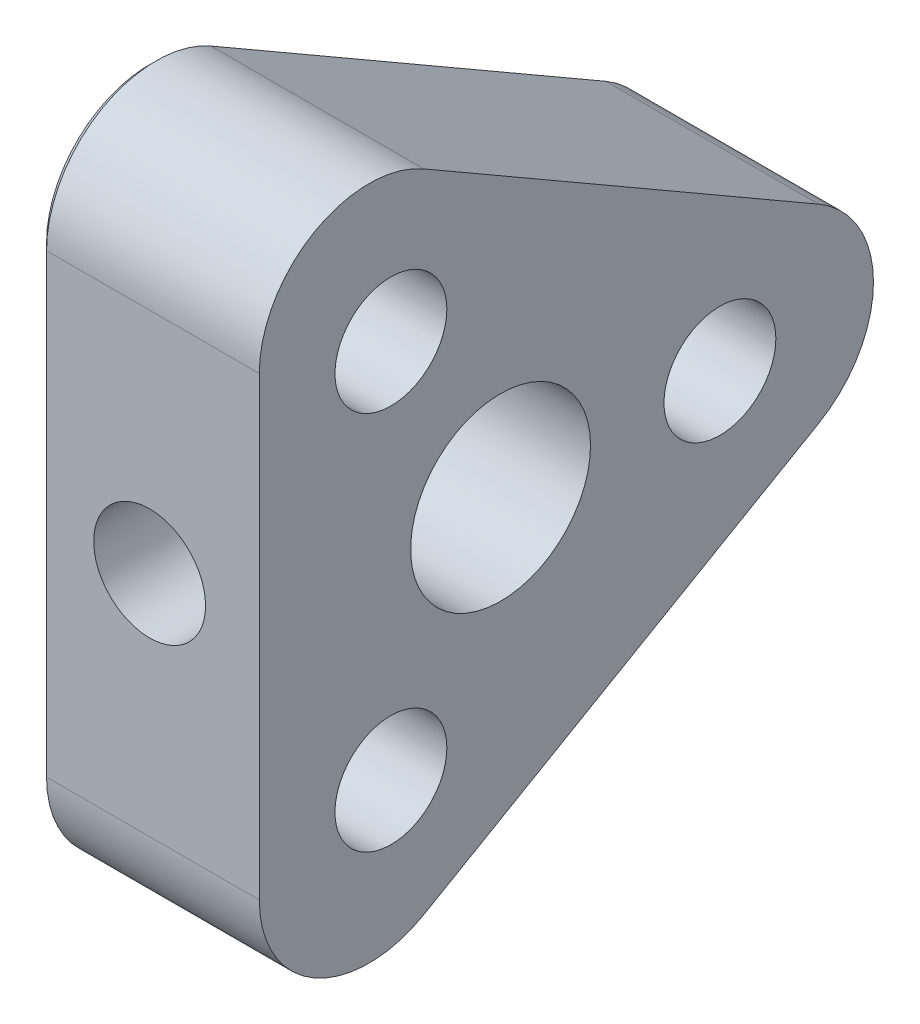
ISO-10303-21;
HEADER;
FILE_DESCRIPTION(('STEP AP214'),'2;1');
FILE_NAME('part.step','',(''),(''),'','','');
FILE_SCHEMA(('AUTOMOTIVE_DESIGN { 1 0 10303 214 1 1 1 1 }'));
ENDSEC;
DATA;
#1=APPLICATION_CONTEXT('core data for automotive mechanical design processes');
#2=APPLICATION_PROTOCOL_DEFINITION('international standard','automotive_design',2000,#1);
#3=PRODUCT_CONTEXT('',#1,'mechanical');
#4=PRODUCT('Part','Part','',(#3));
#5=PRODUCT_RELATED_PRODUCT_CATEGORY('part','',(#4));
#6=PRODUCT_DEFINITION_FORMATION('','',#4);
#7=PRODUCT_DEFINITION_CONTEXT('part definition',#1,'design');
#8=PRODUCT_DEFINITION('design','',#6,#7);
#9=PRODUCT_DEFINITION_SHAPE('','',#8);
#10=(LENGTH_UNIT() NAMED_UNIT(*) SI_UNIT(.MILLI.,.METRE.));
#11=(NAMED_UNIT(*) PLANE_ANGLE_UNIT() SI_UNIT($,.RADIAN.));
#12=(NAMED_UNIT(*) SI_UNIT($,.STERADIAN.) SOLID_ANGLE_UNIT());
#13=UNCERTAINTY_MEASURE_WITH_UNIT(LENGTH_MEASURE(1.E-05),#10,'distance_accuracy_value','');
#14=(GEOMETRIC_REPRESENTATION_CONTEXT(3) GLOBAL_UNCERTAINTY_ASSIGNED_CONTEXT((#13)) GLOBAL_UNIT_ASSIGNED_CONTEXT((#10,
#11,#12)) REPRESENTATION_CONTEXT('',''));
#15=CARTESIAN_POINT('',(0.,0.,0.));
#16=DIRECTION('',(0.,0.,1.));
#17=DIRECTION('',(1.,0.,0.));
#18=AXIS2_PLACEMENT_3D('',#15,#16,#17);
#19=CARTESIAN_POINT('',(28.,0.,0.));
#20=DIRECTION('',(1.,0.,0.));
#21=DIRECTION('',(0.,0.,-1.));
#22=AXIS2_PLACEMENT_3D('',#19,#20,#21);
#23=PLANE('',#22);
#24=CARTESIAN_POINT('',(27.9999999999632,0.,-10.));
#25=DIRECTION('',(-1.,0.,0.));
#26=DIRECTION('',(0.,0.,1.));
#27=AXIS2_PLACEMENT_3D('',#24,#25,#26);
#28=CIRCLE('',#27,2.84999999997581);
#29=CARTESIAN_POINT('',(27.9999999999632,0.,-12.8499999999758));
#30=VERTEX_POINT('',#29);
#31=EDGE_CURVE('E36',#30,#30,#28,.F.);
#32=ORIENTED_EDGE('',*,*,#31,.T.);
#33=EDGE_LOOP('',(#32));
#34=FACE_BOUND('',#33,.T.);
#35=CARTESIAN_POINT('',(27.9999999999632,8.66025403784439,5.));
#36=DIRECTION('',(-1.,0.,0.));
#37=DIRECTION('',(0.,-1.,0.));
#38=AXIS2_PLACEMENT_3D('',#35,#36,#37);
#39=CIRCLE('',#38,2.84999999996217);
#40=CARTESIAN_POINT('',(27.9999999999632,8.66025403784439,2.15000000003783));
#41=VERTEX_POINT('',#40);
#42=EDGE_CURVE('E409',#41,#41,#39,.F.);
#43=ORIENTED_EDGE('',*,*,#42,.T.);
#44=EDGE_LOOP('',(#43));
#45=FACE_BOUND('',#44,.T.);
#46=CARTESIAN_POINT('',(27.9999999999632,-8.66025403784439,5.));
#47=DIRECTION('',(-1.,0.,0.));
#48=DIRECTION('',(0.,-1.,0.));
#49=AXIS2_PLACEMENT_3D('',#46,#47,#48);
#50=CIRCLE('',#49,2.84999999996217);
#51=CARTESIAN_POINT('',(27.9999999999632,-8.66025403784439,2.15000000003783));
#52=VERTEX_POINT('',#51);
#53=EDGE_CURVE('E144',#52,#52,#50,.F.);
#54=ORIENTED_EDGE('',*,*,#53,.T.);
#55=EDGE_LOOP('',(#54));
#56=FACE_BOUND('',#55,.T.);
#57=CARTESIAN_POINT('',(27.9999999999632,0.,0.));
#58=DIRECTION('',(-1.,0.,0.));
#59=DIRECTION('',(0.,0.,1.));
#60=AXIS2_PLACEMENT_3D('',#57,#58,#59);
#61=CIRCLE('',#60,4.39999999997553);
#62=CARTESIAN_POINT('',(27.9999999999632,0.,-4.39999999997553));
#63=VERTEX_POINT('',#62);
#64=EDGE_CURVE('E20',#63,#63,#61,.F.);
#65=ORIENTED_EDGE('',*,*,#64,.T.);
#66=EDGE_LOOP('',(#65));
#67=FACE_BOUND('',#66,.T.);
#68=DIRECTION('',(0.,0.5,-0.866025403784439));
#69=VECTOR('',#68,1.);
#70=CARTESIAN_POINT('',(28.,-14.4626242432001,3.65));
#71=LINE('',#70,#69);
#72=CARTESIAN_POINT('',(28.0000000000384,-14.4626242432334,3.64999999998078));
#73=VERTEX_POINT('',#72);
#74=CARTESIAN_POINT('',(27.9999999999632,-4.07031939775668,-14.3500000000035));
#75=VERTEX_POINT('',#74);
#76=EDGE_CURVE('E75',#73,#75,#71,.T.);
#77=ORIENTED_EDGE('',*,*,#76,.F.);
#78=CARTESIAN_POINT('',(28.0000000000769,-10.3923048454133,6.));
#79=DIRECTION('',(1.,0.,0.));
#80=DIRECTION('',(0.,0.,-1.));
#81=AXIS2_PLACEMENT_3D('',#78,#79,#80);
#82=CIRCLE('',#81,4.69999999998527);
#83=CARTESIAN_POINT('',(28.0000000000576,-10.3923048454133,10.7000000000034));
#84=VERTEX_POINT('',#83);
#85=EDGE_CURVE('E63',#84,#73,#82,.T.);
#86=ORIENTED_EDGE('',*,*,#85,.F.);
#87=DIRECTION('',(0.,1.,0.));
#88=VECTOR('',#87,1.);
#89=CARTESIAN_POINT('',(28.,0.,10.7));
#90=LINE('',#89,#88);
#91=CARTESIAN_POINT('',(28.000000000057,10.3923048454133,10.700000000007));
#92=VERTEX_POINT('',#91);
#93=EDGE_CURVE('E102',#92,#84,#90,.F.);
#94=ORIENTED_EDGE('',*,*,#93,.F.);
#95=CARTESIAN_POINT('',(28.0000000000286,10.3923048454133,6.));
#96=DIRECTION('',(1.,0.,0.));
#97=DIRECTION('',(0.,0.,-1.));
#98=AXIS2_PLACEMENT_3D('',#95,#96,#97);
#99=CIRCLE('',#98,4.699999999937);
#100=CARTESIAN_POINT('',(28.000000000057,14.46262424317,3.65000000001075));
#101=VERTEX_POINT('',#100);
#102=EDGE_CURVE('E322',#101,#92,#99,.T.);
#103=ORIENTED_EDGE('',*,*,#102,.F.);
#104=DIRECTION('',(0.,0.499999999999999,0.866025403784439));
#105=VECTOR('',#104,1.);
#106=CARTESIAN_POINT('',(28.,4.07031939778687,-14.35));
#107=LINE('',#106,#105);
#108=CARTESIAN_POINT('',(27.9999999999816,4.07031939777092,-14.3499999999908));
#109=VERTEX_POINT('',#108);
#110=EDGE_CURVE('E105',#109,#101,#107,.T.);
#111=ORIENTED_EDGE('',*,*,#110,.F.);
#112=CARTESIAN_POINT('',(27.9999999999632,0.,-12.));
#113=DIRECTION('',(1.,0.,0.));
#114=DIRECTION('',(0.,0.,-1.));
#115=AXIS2_PLACEMENT_3D('',#112,#113,#114);
#116=CIRCLE('',#115,4.69999999995753);
#117=EDGE_CURVE('E77',#75,#109,#116,.T.);
#118=ORIENTED_EDGE('',*,*,#117,.F.);
#119=EDGE_LOOP('',(#77,#86,#94,#103,#111,#118));
#120=FACE_BOUND('',#119,.T.);
#121=ADVANCED_FACE('F17',(#34,#45,#56,#67,#120),#23,.F.);
#122=CARTESIAN_POINT('',(27.9999999999063,0.,0.));
#123=DIRECTION('',(-1.,0.,0.));
#124=DIRECTION('',(0.,0.,1.));
#125=AXIS2_PLACEMENT_3D('',#122,#123,#124);
#126=CONICAL_SURFACE('',#125,4.40000000003238,0.785398163397448);
#127=ORIENTED_EDGE('',*,*,#64,.F.);
#128=EDGE_LOOP('',(#127));
#129=FACE_BOUND('',#128,.T.);
#130=CARTESIAN_POINT('',(28.3,0.,0.));
#131=DIRECTION('',(1.,0.,0.));
#132=DIRECTION('',(0.,0.,-1.));
#133=AXIS2_PLACEMENT_3D('',#130,#131,#132);
#134=CIRCLE('',#133,4.1);
#135=CARTESIAN_POINT('',(28.2999999999723,0.,-4.099999999997));
#136=VERTEX_POINT('',#135);
#137=EDGE_CURVE('E143',#136,#136,#134,.T.);
#138=ORIENTED_EDGE('',*,*,#137,.T.);
#139=EDGE_LOOP('',(#138));
#140=FACE_BOUND('',#139,.T.);
#141=ADVANCED_FACE('F191',(#129,#140),#126,.F.);
#142=CARTESIAN_POINT('',(33.,0.,11.002));
#143=DIRECTION('',(0.,0.,1.));
#144=DIRECTION('',(1.,0.,0.));
#145=AXIS2_PLACEMENT_3D('',#142,#143,#144);
#146=CYLINDRICAL_SURFACE('',#145,2.55);
#147=CARTESIAN_POINT('',(33.,0.,11.));
#148=DIRECTION('',(0.,0.,1.));
#149=DIRECTION('',(1.,0.,0.));
#150=AXIS2_PLACEMENT_3D('',#147,#148,#149);
#151=CIRCLE('',#150,2.55);
#152=CARTESIAN_POINT('',(35.55,0.,11.));
#153=VERTEX_POINT('',#152);
#154=EDGE_CURVE('E131',#153,#153,#151,.F.);
#155=ORIENTED_EDGE('',*,*,#154,.F.);
#156=EDGE_LOOP('',(#155));
#157=FACE_BOUND('',#156,.T.);
#158=CARTESIAN_POINT('',(35.5466609620963,-0.130452735092406,4.09792411335548));
#159=CARTESIAN_POINT('',(35.5399041437445,-0.262170287676662,4.09372225294922));
#160=CARTESIAN_POINT('',(35.5228742022845,-0.393358523537563,4.0831281161888));
#161=CARTESIAN_POINT('',(35.4691997960202,-0.650287770915799,4.05018626807768));
#162=CARTESIAN_POINT('',(35.4325060808822,-0.776014244260629,4.02780904700573));
#163=CARTESIAN_POINT('',(35.3415928653053,-1.01785860422746,3.97356712742148));
#164=CARTESIAN_POINT('',(35.2874743518211,-1.13402712837368,3.94175717907782));
#165=CARTESIAN_POINT('',(35.1637141627132,-1.35533439585735,3.87124987279052));
#166=CARTESIAN_POINT('',(35.0940766680501,-1.46047609872629,3.83255437044517));
#167=CARTESIAN_POINT('',(34.9340681100046,-1.66749146629022,3.74741351180574));
#168=CARTESIAN_POINT('',(34.8423845374592,-1.7681902998961,3.70058314662763));
#169=CARTESIAN_POINT('',(34.6443224560579,-1.95375467757053,3.60606626676532));
#170=CARTESIAN_POINT('',(34.537921030599,-2.03859503496051,3.55837851983829));
#171=CARTESIAN_POINT('',(34.2989519988322,-2.19961153058797,3.46142935769778));
#172=CARTESIAN_POINT('',(34.1647847247938,-2.27370436843926,3.41260596939364));
#173=CARTESIAN_POINT('',(33.8822192467792,-2.39745988083343,3.3268468438211));
#174=CARTESIAN_POINT('',(33.7338592515909,-2.4471860582662,3.28988029389007));
#175=CARTESIAN_POINT('',(33.470194446908,-2.50883951315654,3.24295762051417));
#176=CARTESIAN_POINT('',(33.357279187864,-2.52745464583481,3.22833504674904));
#177=CARTESIAN_POINT('',(33.1291030390839,-2.54929947431209,3.21111893357722));
#178=CARTESIAN_POINT('',(33.0138446187797,-2.55254460189437,3.20851332896945));
#179=CARTESIAN_POINT('',(32.784369772758,-2.54346192941411,3.21571560793307));
#180=CARTESIAN_POINT('',(32.6701532913713,-2.53113496631113,3.22552282434751));
#181=CARTESIAN_POINT('',(32.4458036174451,-2.49165985894621,3.25610753453335));
#182=CARTESIAN_POINT('',(32.3356742824951,-2.464498074842,3.27689512360439));
#183=CARTESIAN_POINT('',(32.1183995183921,-2.39555597657218,3.32763932815317));
#184=CARTESIAN_POINT('',(32.0114565010646,-2.35334324616431,3.35786346179583));
#185=CARTESIAN_POINT('',(31.8056546103842,-2.25588620318672,3.42409819431129));
#186=CARTESIAN_POINT('',(31.7067990955357,-2.20063651336964,3.46011117890468));
#187=CARTESIAN_POINT('',(31.498378591671,-2.06545201244579,3.54279560256829));
#188=CARTESIAN_POINT('',(31.3908474812562,-1.98277389780747,3.590128122688));
#189=CARTESIAN_POINT('',(31.1900417693243,-1.80136163811241,3.68450714795485));
#190=CARTESIAN_POINT('',(31.0967817998555,-1.70261122548275,3.73155331268918));
#191=CARTESIAN_POINT('',(30.9162823068947,-1.47773145696134,3.8265936020673));
#192=CARTESIAN_POINT('',(30.8310172389174,-1.34975157366427,3.87405699718145));
#193=CARTESIAN_POINT('',(30.7207071767081,-1.14599786265686,3.93723053407841));
#194=CARTESIAN_POINT('',(30.6868616346989,-1.07609546185281,3.95695570580834));
#195=CARTESIAN_POINT('',(30.6254569303558,-0.932795471263197,3.99316110099951));
#196=CARTESIAN_POINT('',(30.5978934739451,-0.859400310661945,4.00964353994818));
#197=CARTESIAN_POINT('',(30.5518500574135,-0.717010325542765,4.03740461107926));
#198=CARTESIAN_POINT('',(30.5327462046073,-0.648284921882418,4.04903407679013));
#199=CARTESIAN_POINT('',(30.5003028922811,-0.509039029816889,4.06888445411287));
#200=CARTESIAN_POINT('',(30.4869601145982,-0.438519599556344,4.07710732768309));
#201=CARTESIAN_POINT('',(30.466257297472,-0.296317470641466,4.0899003555909));
#202=CARTESIAN_POINT('',(30.4588935880019,-0.224635513166345,4.09447275060903));
#203=CARTESIAN_POINT('',(30.4502601901206,-0.0807899983855504,4.09983718092556));
#204=CARTESIAN_POINT('',(30.4489897868787,-0.00862649856628736,4.10062965966137));
#205=CARTESIAN_POINT('',(30.4539028800825,0.188135905421373,4.09757038078133));
#206=CARTESIAN_POINT('',(30.4661980071068,0.31259486393144,4.08991020298356));
#207=CARTESIAN_POINT('',(30.5085195960453,0.557196396756213,4.06382901100274));
#208=CARTESIAN_POINT('',(30.5385472185434,0.677338688000896,4.04540729248242));
#209=CARTESIAN_POINT('',(30.6149129308982,0.910443248644792,3.99940150098472));
#210=CARTESIAN_POINT('',(30.6612544744895,1.02340399169309,3.97181548795233));
#211=CARTESIAN_POINT('',(30.768525387551,1.24001994115746,3.90961281610275));
#212=CARTESIAN_POINT('',(30.8294580616281,1.34367303224904,3.87499456489041));
#213=CARTESIAN_POINT('',(30.9725514952297,1.55237436187315,3.79658111317536));
#214=CARTESIAN_POINT('',(31.0563985002128,1.65603739125022,3.75218120711561));
#215=CARTESIAN_POINT('',(31.2386455816585,1.8487167683046,3.66109731041355));
#216=CARTESIAN_POINT('',(31.3370663581107,1.93771189602217,3.61441013519802));
#217=CARTESIAN_POINT('',(31.5607259128383,2.11032579230066,3.51675614496074));
#218=CARTESIAN_POINT('',(31.6877880285716,2.19173430423776,3.46602400681145));
#219=CARTESIAN_POINT('',(31.9568008682976,2.33176421316462,3.37341756792811));
#220=CARTESIAN_POINT('',(32.0987247807438,2.39042577724338,3.33152771345498));
#221=CARTESIAN_POINT('',(32.356106962659,2.47003245941369,3.27272489878113));
#222=CARTESIAN_POINT('',(32.4689215053943,2.49680760472072,3.25215448527045));
#223=CARTESIAN_POINT('',(32.6985704874179,2.53478563423529,3.22264816951236));
#224=CARTESIAN_POINT('',(32.8153992017282,2.54600982358825,3.2136963506052));
#225=CARTESIAN_POINT('',(33.0500530962638,2.55221506249645,3.20877225865165));
#226=CARTESIAN_POINT('',(33.1678799950133,2.54715706612896,3.21283118626862));
#227=CARTESIAN_POINT('',(33.4006761728686,2.52105207686046,3.23335032328925));
#228=CARTESIAN_POINT('',(33.5156430720538,2.49999219940861,3.24982052603637));
#229=CARTESIAN_POINT('',(33.7376415145354,2.44361800296143,3.29240535547526));
#230=CARTESIAN_POINT('',(33.8447825542881,2.40858308435859,3.31833013513971));
#231=CARTESIAN_POINT('',(34.0519093933025,2.32560741326367,3.37699960699717));
#232=CARTESIAN_POINT('',(34.1518925808247,2.27766198009101,3.40974677165547));
#233=CARTESIAN_POINT('',(34.361714210114,2.15992800347091,3.48575426301444));
#234=CARTESIAN_POINT('',(34.4699039740158,2.0877320718869,3.5298357107395));
#235=CARTESIAN_POINT('',(34.6738089046535,1.92812018663448,3.61949507405141));
#236=CARTESIAN_POINT('',(34.7695119486817,1.84068963193273,3.66507439089639));
#237=CARTESIAN_POINT('',(34.9612865898476,1.63660418641098,3.76114307424338));
#238=CARTESIAN_POINT('',(35.0549774060266,1.51751205675337,3.81125449369088));
#239=CARTESIAN_POINT('',(35.220952462818,1.26213248141704,3.90324978353093));
#240=CARTESIAN_POINT('',(35.2932369422789,1.12584522762292,3.94513374572235));
#241=CARTESIAN_POINT('',(35.3811829345579,0.915339436990272,3.99712780506929));
#242=CARTESIAN_POINT('',(35.4065957926548,0.846317662418214,4.01234182731561));
#243=CARTESIAN_POINT('',(35.4514976918606,0.705754407409996,4.03943265472399));
#244=CARTESIAN_POINT('',(35.4709903136906,0.634214479360271,4.05131147677663));
#245=CARTESIAN_POINT('',(35.5036915981627,0.489413528489856,4.07133957554493));
#246=CARTESIAN_POINT('',(35.5169173313403,0.4161577581618,4.07949898133934));
#247=CARTESIAN_POINT('',(35.5369196947714,0.268481798571886,4.09186985673738));
#248=CARTESIAN_POINT('',(35.5437012813272,0.194062549015099,4.09608436039473));
#249=CARTESIAN_POINT('',(35.5491526005754,0.0778346229642364,4.09947283676154));
#250=CARTESIAN_POINT('',(35.5500833529603,0.0361581041093124,4.10005164643912));
#251=CARTESIAN_POINT('',(35.5499047352607,-0.0471807952064462,4.09994094501357));
#252=CARTESIAN_POINT('',(35.548795440198,-0.0888431761308434,4.09925148055061));
#253=CARTESIAN_POINT('',(35.5466609620963,-0.130452735092406,4.09792411335548));
#254=B_SPLINE_CURVE_WITH_KNOTS('',3,(#158,#159,#160,#161,#162,#163,#164,#165,#166,#167,#168,
#169,#170,#171,#172,#173,#174,#175,#176,#177,#178,#179,#180,#181,#182,#183,#184,#185,#186,#187,
#188,#189,#190,#191,#192,#193,#194,#195,#196,#197,#198,#199,#200,#201,#202,#203,#204,#205,#206,
#207,#208,#209,#210,#211,#212,#213,#214,#215,#216,#217,#218,#219,#220,#221,#222,#223,#224,#225,
#226,#227,#228,#229,#230,#231,#232,#233,#234,#235,#236,#237,#238,#239,#240,#241,#242,#243,#244,
#245,#246,#247,#248,#249,#250,#251,#252,#253),.UNSPECIFIED.,.T.,.F.,(4,2,2,2,2,2,2,2,2,2,2,2,2,
2,2,2,2,2,2,2,2,2,2,2,2,2,2,2,2,2,2,2,2,2,2,2,2,2,2,2,2,2,2,2,2,2,2,4),(0.,0.395702116641848,
0.792399981846033,1.18683892863306,1.58117173802056,2.01150766932835,2.4425213651134,
2.9225627265496,3.40134629046858,3.74594060324644,4.09018886320321,4.43441862149396,
4.77896541517463,5.13433564326194,5.48985270498944,5.91913658679272,6.34885770156394,
6.82875467106721,7.06883314968122,7.30874702879927,7.52525138156047,7.74163086905714,
7.9578774394977,8.17409864054598,8.54800534906232,8.92193653232133,9.29594692624378,
9.67004210648286,10.0899743966787,10.5105089667275,10.9858207846034,11.4602894215847,
11.8120935515298,12.1634152240196,12.515580019715,12.8680286757825,13.2137582553695,
13.5596133476616,13.9700842572908,14.380950752643,14.8574165689106,15.3338770686496,
15.5589158774469,15.7838183043066,16.008104541111,16.2322181356129,16.3572249834694,
16.4822272343508),.UNSPECIFIED.);
#255=CARTESIAN_POINT('',(35.5466609683441,-0.130452720602276,4.09792411931791));
#256=VERTEX_POINT('',#255);
#257=EDGE_CURVE('E135',#256,#256,#254,.T.);
#258=ORIENTED_EDGE('',*,*,#257,.T.);
#259=EDGE_LOOP('',(#258));
#260=FACE_BOUND('',#259,.T.);
#261=ADVANCED_FACE('F146',(#157,#260),#146,.F.);
#262=CARTESIAN_POINT('',(28.,0.,10.7));
#263=DIRECTION('',(-0.707106781186546,0.,0.70710678118655));
#264=DIRECTION('',(0.70710678118655,0.,0.707106781186546));
#265=AXIS2_PLACEMENT_3D('',#262,#263,#264);
#266=PLANE('',#265);
#267=DIRECTION('',(-0.707106781184743,0.,-0.707106781188352));
#268=VECTOR('',#267,1.);
#269=CARTESIAN_POINT('',(499000.,-10.3923048453522,498982.700002546));
#270=LINE('',#269,#268);
#271=CARTESIAN_POINT('',(28.3000000000004,-10.3923048454133,10.9999999999918));
#272=VERTEX_POINT('',#271);
#273=EDGE_CURVE('E72',#272,#84,#270,.T.);
#274=ORIENTED_EDGE('',*,*,#273,.F.);
#275=DIRECTION('',(0.,1.,0.));
#276=VECTOR('',#275,1.);
#277=CARTESIAN_POINT('',(28.3,0.,11.));
#278=LINE('',#277,#276);
#279=CARTESIAN_POINT('',(28.3000000000004,10.3923048454133,10.9999999999918));
#280=VERTEX_POINT('',#279);
#281=EDGE_CURVE('E134',#280,#272,#278,.F.);
#282=ORIENTED_EDGE('',*,*,#281,.F.);
#283=DIRECTION('',(-0.707106781184743,0.,-0.707106781188352));
#284=VECTOR('',#283,1.);
#285=CARTESIAN_POINT('',(499000.,10.3923048454744,498982.700002546));
#286=LINE('',#285,#284);
#287=EDGE_CURVE('E107',#92,#280,#286,.F.);
#288=ORIENTED_EDGE('',*,*,#287,.F.);
#289=ORIENTED_EDGE('',*,*,#93,.T.);
#290=EDGE_LOOP('',(#274,#282,#288,#289));
#291=FACE_BOUND('',#290,.T.);
#292=ADVANCED_FACE('F184',(#291),#266,.T.);
#293=CARTESIAN_POINT('',(28.3000000000015,-10.3923048454133,6.));
#294=DIRECTION('',(1.,0.,0.));
#295=DIRECTION('',(0.,0.,-1.));
#296=AXIS2_PLACEMENT_3D('',#293,#294,#295);
#297=CONICAL_SURFACE('',#296,4.9999999999668,0.785398163492187);
#298=DIRECTION('',(-0.707106781186554,0.612372435695769,0.353553390593306));
#299=VECTOR('',#298,1.);
#300=CARTESIAN_POINT('',(28.3,-14.7224318643354,3.49999999999999));
#301=LINE('',#300,#299);
#302=CARTESIAN_POINT('',(28.3,-14.7224318643354,3.49999999999998));
#303=VERTEX_POINT('',#302);
#304=EDGE_CURVE('E69',#303,#73,#301,.T.);
#305=ORIENTED_EDGE('',*,*,#304,.F.);
#306=CARTESIAN_POINT('',(28.3,-10.3923048454133,6.));
#307=DIRECTION('',(1.,0.,0.));
#308=DIRECTION('',(0.,0.,-1.));
#309=AXIS2_PLACEMENT_3D('',#306,#307,#308);
#310=CIRCLE('',#309,5.);
#311=EDGE_CURVE('E95',#272,#303,#310,.T.);
#312=ORIENTED_EDGE('',*,*,#311,.F.);
#313=ORIENTED_EDGE('',*,*,#273,.T.);
#314=ORIENTED_EDGE('',*,*,#85,.T.);
#315=EDGE_LOOP('',(#305,#312,#313,#314));
#316=FACE_BOUND('',#315,.T.);
#317=ADVANCED_FACE('F65',(#316),#297,.T.);
#318=CARTESIAN_POINT('',(28.,-9.26647182049349,-5.35));
#319=DIRECTION('',(-0.707106781186546,-0.612372435695796,-0.353553390593275));
#320=DIRECTION('',(0.654653670707979,-0.755928946018453,0.));
#321=AXIS2_PLACEMENT_3D('',#318,#319,#320);
#322=PLANE('',#321);
#323=ORIENTED_EDGE('',*,*,#304,.T.);
#324=ORIENTED_EDGE('',*,*,#76,.T.);
#325=DIRECTION('',(-0.707106781184743,0.612372435697357,0.353553390594176));
#326=VECTOR('',#325,1.);
#327=CARTESIAN_POINT('',(499000.,-432126.498098732,-249500.350001273));
#328=LINE('',#327,#326);
#329=CARTESIAN_POINT('',(28.2999999999862,-4.33012701891037,-14.4999999999924));
#330=VERTEX_POINT('',#329);
#331=EDGE_CURVE('E81',#330,#75,#328,.T.);
#332=ORIENTED_EDGE('',*,*,#331,.F.);
#333=DIRECTION('',(0.,0.5,-0.866025403784439));
#334=VECTOR('',#333,1.);
#335=CARTESIAN_POINT('',(28.3,-9.52627944162882,-5.5));
#336=LINE('',#335,#334);
#337=EDGE_CURVE('E86',#303,#330,#336,.T.);
#338=ORIENTED_EDGE('',*,*,#337,.F.);
#339=EDGE_LOOP('',(#323,#324,#332,#338));
#340=FACE_BOUND('',#339,.T.);
#341=ADVANCED_FACE('F84',(#340),#322,.T.);
#342=CARTESIAN_POINT('',(28.2999999999447,0.,-12.));
#343=DIRECTION('',(1.,0.,0.));
#344=DIRECTION('',(0.,0.,-1.));
#345=AXIS2_PLACEMENT_3D('',#342,#343,#344);
#346=CONICAL_SURFACE('',#345,4.99999999993906,0.785398163397448);
#347=ORIENTED_EDGE('',*,*,#331,.T.);
#348=ORIENTED_EDGE('',*,*,#117,.T.);
#349=DIRECTION('',(-0.707106781186556,-0.61237243569578,0.353553390593282));
#350=VECTOR('',#349,1.);
#351=CARTESIAN_POINT('',(28.3,4.33012701892219,-14.5));
#352=LINE('',#351,#350);
#353=CARTESIAN_POINT('',(28.3,4.33012701892219,-14.5));
#354=VERTEX_POINT('',#353);
#355=EDGE_CURVE('E108',#354,#109,#352,.T.);
#356=ORIENTED_EDGE('',*,*,#355,.F.);
#357=CARTESIAN_POINT('',(28.3,0.,-12.));
#358=DIRECTION('',(1.,0.,0.));
#359=DIRECTION('',(0.,0.,-1.));
#360=AXIS2_PLACEMENT_3D('',#357,#358,#359);
#361=CIRCLE('',#360,5.);
#362=EDGE_CURVE('E292',#330,#354,#361,.T.);
#363=ORIENTED_EDGE('',*,*,#362,.F.);
#364=EDGE_LOOP('',(#347,#348,#356,#363));
#365=FACE_BOUND('',#364,.T.);
#366=ADVANCED_FACE('F176',(#365),#346,.T.);
#367=CARTESIAN_POINT('',(28.,9.26647182049349,-5.35));
#368=DIRECTION('',(-0.707106781186544,0.612372435695798,-0.353553390593275));
#369=DIRECTION('',(-0.654653670707981,-0.755928946018451,0.));
#370=AXIS2_PLACEMENT_3D('',#367,#368,#369);
#371=PLANE('',#370);
#372=ORIENTED_EDGE('',*,*,#355,.T.);
#373=ORIENTED_EDGE('',*,*,#110,.T.);
#374=DIRECTION('',(-0.707106781184743,-0.612372435697354,0.353553390594182));
#375=VECTOR('',#374,1.);
#376=CARTESIAN_POINT('',(499000.,432136.890403575,-249482.350001277));
#377=LINE('',#376,#375);
#378=CARTESIAN_POINT('',(28.3000000000004,14.7224318643265,3.5000000000077));
#379=VERTEX_POINT('',#378);
#380=EDGE_CURVE('E317',#379,#101,#377,.T.);
#381=ORIENTED_EDGE('',*,*,#380,.F.);
#382=DIRECTION('',(0.,0.5,0.866025403784439));
#383=VECTOR('',#382,1.);
#384=CARTESIAN_POINT('',(28.3,9.52627944162882,-5.5));
#385=LINE('',#384,#383);
#386=EDGE_CURVE('E286',#354,#379,#385,.T.);
#387=ORIENTED_EDGE('',*,*,#386,.F.);
#388=EDGE_LOOP('',(#372,#373,#381,#387));
#389=FACE_BOUND('',#388,.T.);
#390=ADVANCED_FACE('F172',(#389),#371,.T.);
#391=CARTESIAN_POINT('',(28.3000000000015,10.3923048454133,6.));
#392=DIRECTION('',(1.,0.,0.));
#393=DIRECTION('',(0.,0.,-1.));
#394=AXIS2_PLACEMENT_3D('',#391,#392,#393);
#395=CONICAL_SURFACE('',#394,4.9999999999668,0.785398163492187);
#396=ORIENTED_EDGE('',*,*,#380,.T.);
#397=ORIENTED_EDGE('',*,*,#102,.T.);
#398=ORIENTED_EDGE('',*,*,#287,.T.);
#399=CARTESIAN_POINT('',(28.3,10.3923048454133,6.));
#400=DIRECTION('',(1.,0.,0.));
#401=DIRECTION('',(0.,0.,-1.));
#402=AXIS2_PLACEMENT_3D('',#399,#400,#401);
#403=CIRCLE('',#402,5.);
#404=EDGE_CURVE('E280',#379,#280,#403,.T.);
#405=ORIENTED_EDGE('',*,*,#404,.F.);
#406=EDGE_LOOP('',(#396,#397,#398,#405));
#407=FACE_BOUND('',#406,.T.);
#408=ADVANCED_FACE('F168',(#407),#395,.T.);
#409=CARTESIAN_POINT('',(28.0000000000769,0.,-10.));
#410=DIRECTION('',(-1.,0.,0.));
#411=DIRECTION('',(0.,0.,1.));
#412=AXIS2_PLACEMENT_3D('',#409,#410,#411);
#413=CONICAL_SURFACE('',#412,2.84999999986212,0.785398163397448);
#414=ORIENTED_EDGE('',*,*,#31,.F.);
#415=EDGE_LOOP('',(#414));
#416=FACE_BOUND('',#415,.T.);
#417=CARTESIAN_POINT('',(28.3,0.,-10.));
#418=DIRECTION('',(1.,0.,0.));
#419=DIRECTION('',(0.,0.,-1.));
#420=AXIS2_PLACEMENT_3D('',#417,#418,#419);
#421=CIRCLE('',#420,2.55);
#422=CARTESIAN_POINT('',(28.2999999999723,0.,-12.5499999999971));
#423=VERTEX_POINT('',#422);
#424=EDGE_CURVE('E271',#423,#423,#421,.T.);
#425=ORIENTED_EDGE('',*,*,#424,.T.);
#426=EDGE_LOOP('',(#425));
#427=FACE_BOUND('',#426,.T.);
#428=ADVANCED_FACE('F164',(#416,#427),#413,.F.);
#429=CARTESIAN_POINT('',(27.9999999999632,8.66025403784439,5.));
#430=DIRECTION('',(-1.,0.,0.));
#431=DIRECTION('',(0.,-1.,0.));
#432=AXIS2_PLACEMENT_3D('',#429,#430,#431);
#433=CONICAL_SURFACE('',#432,2.84999999996217,0.785398163397448);
#434=ORIENTED_EDGE('',*,*,#42,.F.);
#435=EDGE_LOOP('',(#434));
#436=FACE_BOUND('',#435,.T.);
#437=CARTESIAN_POINT('',(28.3,8.66025403784439,5.));
#438=DIRECTION('',(1.,0.,0.));
#439=DIRECTION('',(0.,0.,-1.));
#440=AXIS2_PLACEMENT_3D('',#437,#438,#439);
#441=CIRCLE('',#440,2.55);
#442=CARTESIAN_POINT('',(28.2999999999723,8.66025403784439,2.45000000000969));
#443=VERTEX_POINT('',#442);
#444=EDGE_CURVE('E266',#443,#443,#441,.T.);
#445=ORIENTED_EDGE('',*,*,#444,.T.);
#446=EDGE_LOOP('',(#445));
#447=FACE_BOUND('',#446,.T.);
#448=ADVANCED_FACE('F160',(#436,#447),#433,.F.);
#449=CARTESIAN_POINT('',(27.9999999999632,-8.66025403784439,5.));
#450=DIRECTION('',(-1.,0.,0.));
#451=DIRECTION('',(0.,-1.,0.));
#452=AXIS2_PLACEMENT_3D('',#449,#450,#451);
#453=CONICAL_SURFACE('',#452,2.84999999996217,0.785398163397448);
#454=ORIENTED_EDGE('',*,*,#53,.F.);
#455=EDGE_LOOP('',(#454));
#456=FACE_BOUND('',#455,.T.);
#457=CARTESIAN_POINT('',(28.3,-8.66025403784439,5.));
#458=DIRECTION('',(1.,0.,0.));
#459=DIRECTION('',(0.,0.,-1.));
#460=AXIS2_PLACEMENT_3D('',#457,#458,#459);
#461=CIRCLE('',#460,2.55);
#462=CARTESIAN_POINT('',(28.2999999999723,-8.66025403784439,2.45000000000969));
#463=VERTEX_POINT('',#462);
#464=EDGE_CURVE('E130',#463,#463,#461,.T.);
#465=ORIENTED_EDGE('',*,*,#464,.T.);
#466=EDGE_LOOP('',(#465));
#467=FACE_BOUND('',#466,.T.);
#468=ADVANCED_FACE('F155',(#456,#467),#453,.F.);
#469=CARTESIAN_POINT('',(38.002,0.,0.));
#470=DIRECTION('',(1.,0.,0.));
#471=DIRECTION('',(0.,0.,-1.));
#472=AXIS2_PLACEMENT_3D('',#469,#470,#471);
#473=CYLINDRICAL_SURFACE('',#472,4.1);
#474=ORIENTED_EDGE('',*,*,#257,.F.);
#475=EDGE_LOOP('',(#474));
#476=FACE_BOUND('',#475,.T.);
#477=CARTESIAN_POINT('',(38.,0.,0.));
#478=DIRECTION('',(1.,0.,0.));
#479=DIRECTION('',(0.,0.,-1.));
#480=AXIS2_PLACEMENT_3D('',#477,#478,#479);
#481=CIRCLE('',#480,4.1);
#482=CARTESIAN_POINT('',(38.,0.,-4.1));
#483=VERTEX_POINT('',#482);
#484=EDGE_CURVE('E127',#483,#483,#481,.F.);
#485=ORIENTED_EDGE('',*,*,#484,.F.);
#486=EDGE_LOOP('',(#485));
#487=FACE_BOUND('',#486,.T.);
#488=ORIENTED_EDGE('',*,*,#137,.F.);
#489=EDGE_LOOP('',(#488));
#490=FACE_BOUND('',#489,.T.);
#491=ADVANCED_FACE('F149',(#476,#487,#490),#473,.F.);
#492=CARTESIAN_POINT('',(38.002,0.,11.));
#493=DIRECTION('',(0.,0.,1.));
#494=DIRECTION('',(1.,0.,0.));
#495=AXIS2_PLACEMENT_3D('',#492,#493,#494);
#496=PLANE('',#495);
#497=DIRECTION('',(1.,0.,0.));
#498=VECTOR('',#497,1.);
#499=CARTESIAN_POINT('',(38.002,-10.3923048454133,11.));
#500=LINE('',#499,#498);
#501=CARTESIAN_POINT('',(38.,-10.3923048454133,11.));
#502=VERTEX_POINT('',#501);
#503=EDGE_CURVE('E98',#502,#272,#500,.F.);
#504=ORIENTED_EDGE('',*,*,#503,.F.);
#505=DIRECTION('',(0.,1.,0.));
#506=VECTOR('',#505,1.);
#507=CARTESIAN_POINT('',(38.,0.,11.));
#508=LINE('',#507,#506);
#509=CARTESIAN_POINT('',(38.,10.3923048454133,11.));
#510=VERTEX_POINT('',#509);
#511=EDGE_CURVE('E126',#510,#502,#508,.F.);
#512=ORIENTED_EDGE('',*,*,#511,.F.);
#513=DIRECTION('',(1.,0.,0.));
#514=VECTOR('',#513,1.);
#515=CARTESIAN_POINT('',(38.002,10.3923048454133,11.));
#516=LINE('',#515,#514);
#517=EDGE_CURVE('E276',#280,#510,#516,.T.);
#518=ORIENTED_EDGE('',*,*,#517,.F.);
#519=ORIENTED_EDGE('',*,*,#281,.T.);
#520=EDGE_LOOP('',(#504,#512,#518,#519));
#521=FACE_BOUND('',#520,.T.);
#522=ORIENTED_EDGE('',*,*,#154,.T.);
#523=EDGE_LOOP('',(#522));
#524=FACE_BOUND('',#523,.T.);
#525=ADVANCED_FACE('F154',(#521,#524),#496,.T.);
#526=CARTESIAN_POINT('',(38.002,-10.3923048454133,6.));
#527=DIRECTION('',(1.,0.,0.));
#528=DIRECTION('',(0.,0.,-1.));
#529=AXIS2_PLACEMENT_3D('',#526,#527,#528);
#530=CYLINDRICAL_SURFACE('',#529,5.);
#531=DIRECTION('',(1.,0.,0.));
#532=VECTOR('',#531,1.);
#533=CARTESIAN_POINT('',(38.002,-14.7224318643354,3.49999999999998));
#534=LINE('',#533,#532);
#535=CARTESIAN_POINT('',(38.,-14.7224318643354,3.50000000000001));
#536=VERTEX_POINT('',#535);
#537=EDGE_CURVE('E97',#536,#303,#534,.F.);
#538=ORIENTED_EDGE('',*,*,#537,.F.);
#539=CARTESIAN_POINT('',(38.,-10.3923048454133,6.));
#540=DIRECTION('',(1.,0.,0.));
#541=DIRECTION('',(0.,0.,-1.));
#542=AXIS2_PLACEMENT_3D('',#539,#540,#541);
#543=CIRCLE('',#542,5.);
#544=EDGE_CURVE('E123',#502,#536,#543,.T.);
#545=ORIENTED_EDGE('',*,*,#544,.F.);
#546=ORIENTED_EDGE('',*,*,#503,.T.);
#547=ORIENTED_EDGE('',*,*,#311,.T.);
#548=EDGE_LOOP('',(#538,#545,#546,#547));
#549=FACE_BOUND('',#548,.T.);
#550=ADVANCED_FACE('F227',(#549),#530,.T.);
#551=CARTESIAN_POINT('',(38.002,-9.52627944162882,-5.5));
#552=DIRECTION('',(0.,-0.866025403784439,-0.5));
#553=DIRECTION('',(0.,0.5,-0.866025403784439));
#554=AXIS2_PLACEMENT_3D('',#551,#552,#553);
#555=PLANE('',#554);
#556=DIRECTION('',(1.,0.,0.));
#557=VECTOR('',#556,1.);
#558=CARTESIAN_POINT('',(38.002,-4.33012701892219,-14.5));
#559=LINE('',#558,#557);
#560=CARTESIAN_POINT('',(38.,-4.33012701892219,-14.5));
#561=VERTEX_POINT('',#560);
#562=EDGE_CURVE('E248',#561,#330,#559,.F.);
#563=ORIENTED_EDGE('',*,*,#562,.F.);
#564=DIRECTION('',(0.,0.499999999999998,-0.86602540378444));
#565=VECTOR('',#564,1.);
#566=CARTESIAN_POINT('',(38.,-14.7224318643354,3.5));
#567=LINE('',#566,#565);
#568=EDGE_CURVE('E122',#536,#561,#567,.T.);
#569=ORIENTED_EDGE('',*,*,#568,.F.);
#570=ORIENTED_EDGE('',*,*,#537,.T.);
#571=ORIENTED_EDGE('',*,*,#337,.T.);
#572=EDGE_LOOP('',(#563,#569,#570,#571));
#573=FACE_BOUND('',#572,.T.);
#574=ADVANCED_FACE('F224',(#573),#555,.T.);
#575=CARTESIAN_POINT('',(38.002,0.,-12.));
#576=DIRECTION('',(1.,0.,0.));
#577=DIRECTION('',(0.,0.,-1.));
#578=AXIS2_PLACEMENT_3D('',#575,#576,#577);
#579=CYLINDRICAL_SURFACE('',#578,5.);
#580=DIRECTION('',(1.,0.,0.));
#581=VECTOR('',#580,1.);
#582=CARTESIAN_POINT('',(38.002,4.33012701892219,-14.5));
#583=LINE('',#582,#581);
#584=CARTESIAN_POINT('',(38.,4.3301270189222,-14.5));
#585=VERTEX_POINT('',#584);
#586=EDGE_CURVE('E289',#585,#354,#583,.F.);
#587=ORIENTED_EDGE('',*,*,#586,.F.);
#588=CARTESIAN_POINT('',(38.,0.,-12.));
#589=DIRECTION('',(1.,0.,0.));
#590=DIRECTION('',(0.,0.,-1.));
#591=AXIS2_PLACEMENT_3D('',#588,#589,#590);
#592=CIRCLE('',#591,5.);
#593=EDGE_CURVE('E119',#561,#585,#592,.T.);
#594=ORIENTED_EDGE('',*,*,#593,.F.);
#595=ORIENTED_EDGE('',*,*,#562,.T.);
#596=ORIENTED_EDGE('',*,*,#362,.T.);
#597=EDGE_LOOP('',(#587,#594,#595,#596));
#598=FACE_BOUND('',#597,.T.);
#599=ADVANCED_FACE('F220',(#598),#579,.T.);
#600=CARTESIAN_POINT('',(38.002,9.52627944162882,-5.5));
#601=DIRECTION('',(0.,0.866025403784439,-0.5));
#602=DIRECTION('',(0.,0.5,0.866025403784439));
#603=AXIS2_PLACEMENT_3D('',#600,#601,#602);
#604=PLANE('',#603);
#605=DIRECTION('',(1.,0.,0.));
#606=VECTOR('',#605,1.);
#607=CARTESIAN_POINT('',(38.002,14.7224318643355,3.49999999999996));
#608=LINE('',#607,#606);
#609=CARTESIAN_POINT('',(38.,14.7224318643354,3.50000000000001));
#610=VERTEX_POINT('',#609);
#611=EDGE_CURVE('E283',#610,#379,#608,.F.);
#612=ORIENTED_EDGE('',*,*,#611,.F.);
#613=DIRECTION('',(0.,0.499999999999998,0.86602540378444));
#614=VECTOR('',#613,1.);
#615=CARTESIAN_POINT('',(38.,4.3301270189222,-14.5));
#616=LINE('',#615,#614);
#617=EDGE_CURVE('E118',#585,#610,#616,.T.);
#618=ORIENTED_EDGE('',*,*,#617,.F.);
#619=ORIENTED_EDGE('',*,*,#586,.T.);
#620=ORIENTED_EDGE('',*,*,#386,.T.);
#621=EDGE_LOOP('',(#612,#618,#619,#620));
#622=FACE_BOUND('',#621,.T.);
#623=ADVANCED_FACE('F216',(#622),#604,.T.);
#624=CARTESIAN_POINT('',(38.002,10.3923048454133,6.));
#625=DIRECTION('',(1.,0.,0.));
#626=DIRECTION('',(0.,0.,-1.));
#627=AXIS2_PLACEMENT_3D('',#624,#625,#626);
#628=CYLINDRICAL_SURFACE('',#627,5.);
#629=ORIENTED_EDGE('',*,*,#517,.T.);
#630=CARTESIAN_POINT('',(38.,10.3923048454133,6.));
#631=DIRECTION('',(1.,0.,0.));
#632=DIRECTION('',(0.,0.,-1.));
#633=AXIS2_PLACEMENT_3D('',#630,#631,#632);
#634=CIRCLE('',#633,5.);
#635=EDGE_CURVE('E115',#610,#510,#634,.T.);
#636=ORIENTED_EDGE('',*,*,#635,.F.);
#637=ORIENTED_EDGE('',*,*,#611,.T.);
#638=ORIENTED_EDGE('',*,*,#404,.T.);
#639=EDGE_LOOP('',(#629,#636,#637,#638));
#640=FACE_BOUND('',#639,.T.);
#641=ADVANCED_FACE('F212',(#640),#628,.T.);
#642=CARTESIAN_POINT('',(38.002,0.,-10.));
#643=DIRECTION('',(1.,0.,0.));
#644=DIRECTION('',(0.,0.,-1.));
#645=AXIS2_PLACEMENT_3D('',#642,#643,#644);
#646=CYLINDRICAL_SURFACE('',#645,2.55);
#647=CARTESIAN_POINT('',(38.,0.,-10.));
#648=DIRECTION('',(1.,0.,0.));
#649=DIRECTION('',(0.,0.,-1.));
#650=AXIS2_PLACEMENT_3D('',#647,#648,#649);
#651=CIRCLE('',#650,2.55);
#652=CARTESIAN_POINT('',(38.,0.,-12.55));
#653=VERTEX_POINT('',#652);
#654=EDGE_CURVE('E112',#653,#653,#651,.F.);
#655=ORIENTED_EDGE('',*,*,#654,.F.);
#656=EDGE_LOOP('',(#655));
#657=FACE_BOUND('',#656,.T.);
#658=ORIENTED_EDGE('',*,*,#424,.F.);
#659=EDGE_LOOP('',(#658));
#660=FACE_BOUND('',#659,.T.);
#661=ADVANCED_FACE('F208',(#657,#660),#646,.F.);
#662=CARTESIAN_POINT('',(38.002,8.66025403784439,5.));
#663=DIRECTION('',(1.,0.,0.));
#664=DIRECTION('',(0.,0.,-1.));
#665=AXIS2_PLACEMENT_3D('',#662,#663,#664);
#666=CYLINDRICAL_SURFACE('',#665,2.55);
#667=CARTESIAN_POINT('',(38.,8.66025403784439,5.));
#668=DIRECTION('',(1.,0.,0.));
#669=DIRECTION('',(0.,0.,-1.));
#670=AXIS2_PLACEMENT_3D('',#667,#668,#669);
#671=CIRCLE('',#670,2.55);
#672=CARTESIAN_POINT('',(38.,8.66025403784439,2.45));
#673=VERTEX_POINT('',#672);
#674=EDGE_CURVE('E25',#673,#673,#671,.F.);
#675=ORIENTED_EDGE('',*,*,#674,.F.);
#676=EDGE_LOOP('',(#675));
#677=FACE_BOUND('',#676,.T.);
#678=ORIENTED_EDGE('',*,*,#444,.F.);
#679=EDGE_LOOP('',(#678));
#680=FACE_BOUND('',#679,.T.);
#681=ADVANCED_FACE('F201',(#677,#680),#666,.F.);
#682=CARTESIAN_POINT('',(38.002,-8.66025403784439,5.));
#683=DIRECTION('',(1.,0.,0.));
#684=DIRECTION('',(0.,0.,-1.));
#685=AXIS2_PLACEMENT_3D('',#682,#683,#684);
#686=CYLINDRICAL_SURFACE('',#685,2.55);
#687=CARTESIAN_POINT('',(38.,-8.66025403784439,5.));
#688=DIRECTION('',(1.,0.,0.));
#689=DIRECTION('',(0.,0.,-1.));
#690=AXIS2_PLACEMENT_3D('',#687,#688,#689);
#691=CIRCLE('',#690,2.55);
#692=CARTESIAN_POINT('',(38.,-8.66025403784439,2.45));
#693=VERTEX_POINT('',#692);
#694=EDGE_CURVE('E11',#693,#693,#691,.F.);
#695=ORIENTED_EDGE('',*,*,#694,.F.);
#696=EDGE_LOOP('',(#695));
#697=FACE_BOUND('',#696,.T.);
#698=ORIENTED_EDGE('',*,*,#464,.F.);
#699=EDGE_LOOP('',(#698));
#700=FACE_BOUND('',#699,.T.);
#701=ADVANCED_FACE('F195',(#697,#700),#686,.F.);
#702=CARTESIAN_POINT('',(38.,0.,0.));
#703=DIRECTION('',(1.,0.,0.));
#704=DIRECTION('',(0.,0.,-1.));
#705=AXIS2_PLACEMENT_3D('',#702,#703,#704);
#706=PLANE('',#705);
#707=ORIENTED_EDGE('',*,*,#694,.T.);
#708=EDGE_LOOP('',(#707));
#709=FACE_BOUND('',#708,.T.);
#710=ORIENTED_EDGE('',*,*,#674,.T.);
#711=EDGE_LOOP('',(#710));
#712=FACE_BOUND('',#711,.T.);
#713=ORIENTED_EDGE('',*,*,#654,.T.);
#714=EDGE_LOOP('',(#713));
#715=FACE_BOUND('',#714,.T.);
#716=ORIENTED_EDGE('',*,*,#617,.T.);
#717=ORIENTED_EDGE('',*,*,#635,.T.);
#718=ORIENTED_EDGE('',*,*,#511,.T.);
#719=ORIENTED_EDGE('',*,*,#544,.T.);
#720=ORIENTED_EDGE('',*,*,#568,.T.);
#721=ORIENTED_EDGE('',*,*,#593,.T.);
#722=EDGE_LOOP('',(#716,#717,#718,#719,#720,#721));
#723=FACE_BOUND('',#722,.T.);
#724=ORIENTED_EDGE('',*,*,#484,.T.);
#725=EDGE_LOOP('',(#724));
#726=FACE_BOUND('',#725,.T.);
#727=ADVANCED_FACE('F193',(#709,#712,#715,#723,#726),#706,.T.);
#728=CLOSED_SHELL('',(#121,#141,#261,#292,#317,#341,#366,#390,#408,#428,#448,#468,#491,#525,
#550,#574,#599,#623,#641,#661,#681,#701,#727));
#729=MANIFOLD_SOLID_BREP('B1',#728);
#730=ADVANCED_BREP_SHAPE_REPRESENTATION('',(#18,#729),#14);
#731=SHAPE_DEFINITION_REPRESENTATION(#9,#730);
ENDSEC;
END-ISO-10303-21;
